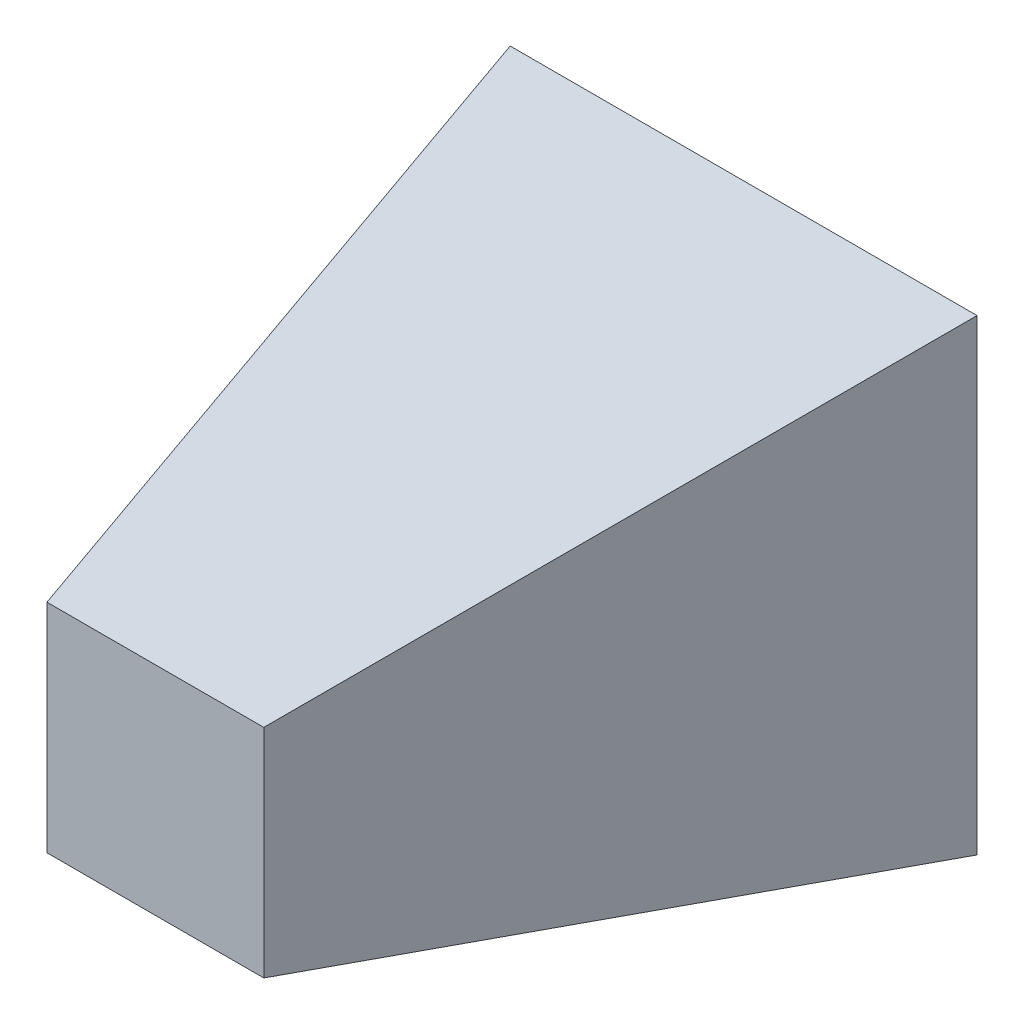
ISO-10303-21;
HEADER;
FILE_DESCRIPTION(('STEP AP214'),'2;1');
FILE_NAME('part.step','',(''),(''),'','','');
FILE_SCHEMA(('AUTOMOTIVE_DESIGN { 1 0 10303 214 1 1 1 1 }'));
ENDSEC;
DATA;
#1=APPLICATION_CONTEXT('core data for automotive mechanical design processes');
#2=APPLICATION_PROTOCOL_DEFINITION('international standard','automotive_design',2000,#1);
#3=PRODUCT_CONTEXT('',#1,'mechanical');
#4=PRODUCT('Part','Part','',(#3));
#5=PRODUCT_RELATED_PRODUCT_CATEGORY('part','',(#4));
#6=PRODUCT_DEFINITION_FORMATION('','',#4);
#7=PRODUCT_DEFINITION_CONTEXT('part definition',#1,'design');
#8=PRODUCT_DEFINITION('design','',#6,#7);
#9=PRODUCT_DEFINITION_SHAPE('','',#8);
#10=(LENGTH_UNIT() NAMED_UNIT(*) SI_UNIT(.MILLI.,.METRE.));
#11=(NAMED_UNIT(*) PLANE_ANGLE_UNIT() SI_UNIT($,.RADIAN.));
#12=(NAMED_UNIT(*) SI_UNIT($,.STERADIAN.) SOLID_ANGLE_UNIT());
#13=UNCERTAINTY_MEASURE_WITH_UNIT(LENGTH_MEASURE(1.E-05),#10,'distance_accuracy_value','');
#14=(GEOMETRIC_REPRESENTATION_CONTEXT(3) GLOBAL_UNCERTAINTY_ASSIGNED_CONTEXT((#13)) GLOBAL_UNIT_ASSIGNED_CONTEXT((#10,
#11,#12)) REPRESENTATION_CONTEXT('',''));
#15=CARTESIAN_POINT('',(0.,0.,0.));
#16=DIRECTION('',(0.,0.,1.));
#17=DIRECTION('',(1.,0.,0.));
#18=AXIS2_PLACEMENT_3D('',#15,#16,#17);
#19=CARTESIAN_POINT('',(8.607,-5.39334053551828,-21.));
#20=DIRECTION('',(-0.978147600733806,0.,0.207911690817759));
#21=DIRECTION('',(0.207911690817759,0.,0.978147600733806));
#22=AXIS2_PLACEMENT_3D('',#19,#20,#21);
#23=PLANE('',#22);
#24=DIRECTION('',(0.,-1.,0.));
#25=VECTOR('',#24,1.);
#26=CARTESIAN_POINT('',(8.607,-5.39334053551828,-21.));
#27=LINE('',#26,#25);
#28=CARTESIAN_POINT('',(8.607,-5.39334053551828,-21.));
#29=VERTEX_POINT('',#28);
#30=CARTESIAN_POINT('',(8.607,-6.02862876205188,-21.));
#31=VERTEX_POINT('',#30);
#32=EDGE_CURVE('E11',#29,#31,#27,.T.);
#33=ORIENTED_EDGE('',*,*,#32,.T.);
#34=DIRECTION('',(-0.203558594952779,-0.203558594952779,-0.957667894857973));
#35=VECTOR('',#34,1.);
#36=CARTESIAN_POINT('',(8.607,-6.02862876205188,-21.));
#37=LINE('',#36,#35);
#38=CARTESIAN_POINT('',(8.77704524933602,-5.85858351271587,-20.2));
#39=VERTEX_POINT('',#38);
#40=EDGE_CURVE('E24',#39,#31,#37,.T.);
#41=ORIENTED_EDGE('',*,*,#40,.F.);
#42=DIRECTION('',(0.,-1.,0.));
#43=VECTOR('',#42,1.);
#44=CARTESIAN_POINT('',(8.77704524933602,-5.39334053551828,-20.2));
#45=LINE('',#44,#43);
#46=CARTESIAN_POINT('',(8.77704524933602,-5.5633857848543,-20.2));
#47=VERTEX_POINT('',#46);
#48=EDGE_CURVE('E88',#47,#39,#45,.T.);
#49=ORIENTED_EDGE('',*,*,#48,.F.);
#50=DIRECTION('',(-0.203558594952779,0.203558594952779,-0.957667894857973));
#51=VECTOR('',#50,1.);
#52=CARTESIAN_POINT('',(8.607,-5.39334053551828,-21.));
#53=LINE('',#52,#51);
#54=EDGE_CURVE('E77',#47,#29,#53,.T.);
#55=ORIENTED_EDGE('',*,*,#54,.T.);
#56=EDGE_LOOP('',(#33,#41,#49,#55));
#57=FACE_BOUND('',#56,.T.);
#58=ADVANCED_FACE('F17',(#57),#23,.T.);
#59=CARTESIAN_POINT('',(8.607,-6.02862876205188,-21.));
#60=DIRECTION('',(0.,-0.978147600733806,0.207911690817759));
#61=DIRECTION('',(0.,-0.207911690817759,-0.978147600733806));
#62=AXIS2_PLACEMENT_3D('',#59,#60,#61);
#63=PLANE('',#62);
#64=DIRECTION('',(1.,0.,0.));
#65=VECTOR('',#64,1.);
#66=CARTESIAN_POINT('',(8.607,-6.02862876205188,-21.));
#67=LINE('',#66,#65);
#68=CARTESIAN_POINT('',(9.242,-6.02862876205188,-21.));
#69=VERTEX_POINT('',#68);
#70=EDGE_CURVE('E85',#31,#69,#67,.T.);
#71=ORIENTED_EDGE('',*,*,#70,.T.);
#72=DIRECTION('',(0.203558594952779,-0.203558594952779,-0.957667894857973));
#73=VECTOR('',#72,1.);
#74=CARTESIAN_POINT('',(9.21567613251331,-6.0023048945652,-20.8761559404242));
#75=LINE('',#74,#73);
#76=CARTESIAN_POINT('',(9.07195475066398,-5.85858351271587,-20.2));
#77=VERTEX_POINT('',#76);
#78=EDGE_CURVE('E83',#77,#69,#75,.T.);
#79=ORIENTED_EDGE('',*,*,#78,.F.);
#80=DIRECTION('',(1.,0.,0.));
#81=VECTOR('',#80,1.);
#82=CARTESIAN_POINT('',(8.607,-5.85858351271587,-20.2));
#83=LINE('',#82,#81);
#84=EDGE_CURVE('E72',#39,#77,#83,.T.);
#85=ORIENTED_EDGE('',*,*,#84,.F.);
#86=ORIENTED_EDGE('',*,*,#40,.T.);
#87=EDGE_LOOP('',(#71,#79,#85,#86));
#88=FACE_BOUND('',#87,.T.);
#89=ADVANCED_FACE('F90',(#88),#63,.T.);
#90=CARTESIAN_POINT('',(9.242,-5.39334053551828,-21.));
#91=DIRECTION('',(0.978147600733806,0.,0.207911690817759));
#92=DIRECTION('',(0.207911690817759,0.,-0.978147600733806));
#93=AXIS2_PLACEMENT_3D('',#90,#91,#92);
#94=PLANE('',#93);
#95=DIRECTION('',(0.,1.,0.));
#96=VECTOR('',#95,1.);
#97=CARTESIAN_POINT('',(9.242,-5.39334053551828,-21.));
#98=LINE('',#97,#96);
#99=CARTESIAN_POINT('',(9.242,-5.39334053551828,-21.));
#100=VERTEX_POINT('',#99);
#101=EDGE_CURVE('E60',#69,#100,#98,.T.);
#102=ORIENTED_EDGE('',*,*,#101,.T.);
#103=DIRECTION('',(0.203558594952779,0.203558594952779,-0.957667894857973));
#104=VECTOR('',#103,1.);
#105=CARTESIAN_POINT('',(9.21568807549724,-5.41965246002104,-20.876212127746));
#106=LINE('',#105,#104);
#107=CARTESIAN_POINT('',(9.07195475066398,-5.5633857848543,-20.2));
#108=VERTEX_POINT('',#107);
#109=EDGE_CURVE('E54',#108,#100,#106,.T.);
#110=ORIENTED_EDGE('',*,*,#109,.F.);
#111=DIRECTION('',(0.,1.,0.));
#112=VECTOR('',#111,1.);
#113=CARTESIAN_POINT('',(9.07195475066398,-5.39334053551828,-20.2));
#114=LINE('',#113,#112);
#115=EDGE_CURVE('E58',#77,#108,#114,.T.);
#116=ORIENTED_EDGE('',*,*,#115,.F.);
#117=ORIENTED_EDGE('',*,*,#78,.T.);
#118=EDGE_LOOP('',(#102,#110,#116,#117));
#119=FACE_BOUND('',#118,.T.);
#120=ADVANCED_FACE('F56',(#119),#94,.T.);
#121=CARTESIAN_POINT('',(8.607,-5.39334053551828,-21.));
#122=DIRECTION('',(0.,0.978147600733806,0.207911690817759));
#123=DIRECTION('',(0.,-0.207911690817759,0.978147600733806));
#124=AXIS2_PLACEMENT_3D('',#121,#122,#123);
#125=PLANE('',#124);
#126=DIRECTION('',(-1.,0.,0.));
#127=VECTOR('',#126,1.);
#128=CARTESIAN_POINT('',(8.607,-5.39334053551828,-21.));
#129=LINE('',#128,#127);
#130=EDGE_CURVE('E73',#100,#29,#129,.T.);
#131=ORIENTED_EDGE('',*,*,#130,.T.);
#132=ORIENTED_EDGE('',*,*,#54,.F.);
#133=DIRECTION('',(-1.,0.,0.));
#134=VECTOR('',#133,1.);
#135=CARTESIAN_POINT('',(8.607,-5.5633857848543,-20.2));
#136=LINE('',#135,#134);
#137=EDGE_CURVE('E70',#108,#47,#136,.T.);
#138=ORIENTED_EDGE('',*,*,#137,.F.);
#139=ORIENTED_EDGE('',*,*,#109,.T.);
#140=EDGE_LOOP('',(#131,#132,#138,#139));
#141=FACE_BOUND('',#140,.T.);
#142=ADVANCED_FACE('F76',(#141),#125,.T.);
#143=CARTESIAN_POINT('',(0.,0.,-20.2));
#144=DIRECTION('',(0.,0.,1.));
#145=DIRECTION('',(1.,0.,0.));
#146=AXIS2_PLACEMENT_3D('',#143,#144,#145);
#147=PLANE('',#146);
#148=ORIENTED_EDGE('',*,*,#48,.T.);
#149=ORIENTED_EDGE('',*,*,#84,.T.);
#150=ORIENTED_EDGE('',*,*,#115,.T.);
#151=ORIENTED_EDGE('',*,*,#137,.T.);
#152=EDGE_LOOP('',(#148,#149,#150,#151));
#153=FACE_BOUND('',#152,.T.);
#154=ADVANCED_FACE('F69',(#153),#147,.T.);
#155=CARTESIAN_POINT('',(0.,0.,-21.));
#156=DIRECTION('',(0.,0.,1.));
#157=DIRECTION('',(1.,0.,0.));
#158=AXIS2_PLACEMENT_3D('',#155,#156,#157);
#159=PLANE('',#158);
#160=ORIENTED_EDGE('',*,*,#32,.F.);
#161=ORIENTED_EDGE('',*,*,#130,.F.);
#162=ORIENTED_EDGE('',*,*,#101,.F.);
#163=ORIENTED_EDGE('',*,*,#70,.F.);
#164=EDGE_LOOP('',(#160,#161,#162,#163));
#165=FACE_BOUND('',#164,.T.);
#166=ADVANCED_FACE('F91',(#165),#159,.F.);
#167=CLOSED_SHELL('',(#58,#89,#120,#142,#154,#166));
#168=MANIFOLD_SOLID_BREP('B1',#167);
#169=ADVANCED_BREP_SHAPE_REPRESENTATION('',(#18,#168),#14);
#170=SHAPE_DEFINITION_REPRESENTATION(#9,#169);
ENDSEC;
END-ISO-10303-21;
